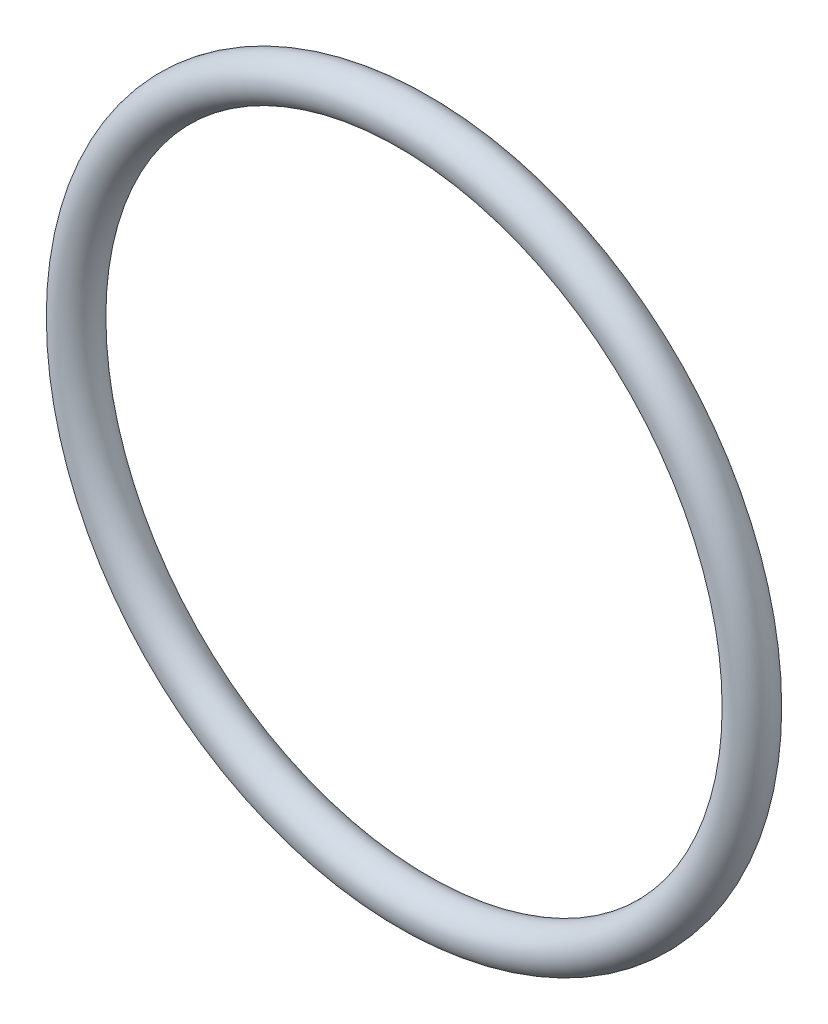
ISO-10303-21;
HEADER;
FILE_DESCRIPTION(('STEP AP214'),'2;1');
FILE_NAME('part.step','',(''),(''),'','','');
FILE_SCHEMA(('AUTOMOTIVE_DESIGN { 1 0 10303 214 1 1 1 1 }'));
ENDSEC;
DATA;
#1=APPLICATION_CONTEXT('core data for automotive mechanical design processes');
#2=APPLICATION_PROTOCOL_DEFINITION('international standard','automotive_design',2000,#1);
#3=PRODUCT_CONTEXT('',#1,'mechanical');
#4=PRODUCT('Part','Part','',(#3));
#5=PRODUCT_RELATED_PRODUCT_CATEGORY('part','',(#4));
#6=PRODUCT_DEFINITION_FORMATION('','',#4);
#7=PRODUCT_DEFINITION_CONTEXT('part definition',#1,'design');
#8=PRODUCT_DEFINITION('design','',#6,#7);
#9=PRODUCT_DEFINITION_SHAPE('','',#8);
#10=(LENGTH_UNIT() NAMED_UNIT(*) SI_UNIT(.MILLI.,.METRE.));
#11=(NAMED_UNIT(*) PLANE_ANGLE_UNIT() SI_UNIT($,.RADIAN.));
#12=(NAMED_UNIT(*) SI_UNIT($,.STERADIAN.) SOLID_ANGLE_UNIT());
#13=UNCERTAINTY_MEASURE_WITH_UNIT(LENGTH_MEASURE(1.E-05),#10,'distance_accuracy_value','');
#14=(GEOMETRIC_REPRESENTATION_CONTEXT(3) GLOBAL_UNCERTAINTY_ASSIGNED_CONTEXT((#13)) GLOBAL_UNIT_ASSIGNED_CONTEXT((#10,
#11,#12)) REPRESENTATION_CONTEXT('',''));
#15=CARTESIAN_POINT('',(0.,0.,0.));
#16=DIRECTION('',(0.,0.,1.));
#17=DIRECTION('',(1.,0.,0.));
#18=AXIS2_PLACEMENT_3D('',#15,#16,#17);
#19=CARTESIAN_POINT('',(0.,0.,0.));
#20=DIRECTION('',(0.,0.,1.));
#21=DIRECTION('',(1.,0.,0.));
#22=AXIS2_PLACEMENT_3D('',#19,#20,#21);
#23=TOROIDAL_SURFACE('',#22,20.9804,1.3081);
#24=CARTESIAN_POINT('',(22.2885,0.,0.));
#25=VERTEX_POINT('',#24);
#26=VERTEX_LOOP('',#25);
#27=FACE_BOUND('',#26,.T.);
#28=ADVANCED_FACE('F28',(#27),#23,.T.);
#29=CLOSED_SHELL('',(#28));
#30=MANIFOLD_SOLID_BREP('B2',#29);
#31=ADVANCED_BREP_SHAPE_REPRESENTATION('',(#18,#30),#14);
#32=SHAPE_DEFINITION_REPRESENTATION(#9,#31);
ENDSEC;
END-ISO-10303-21;
